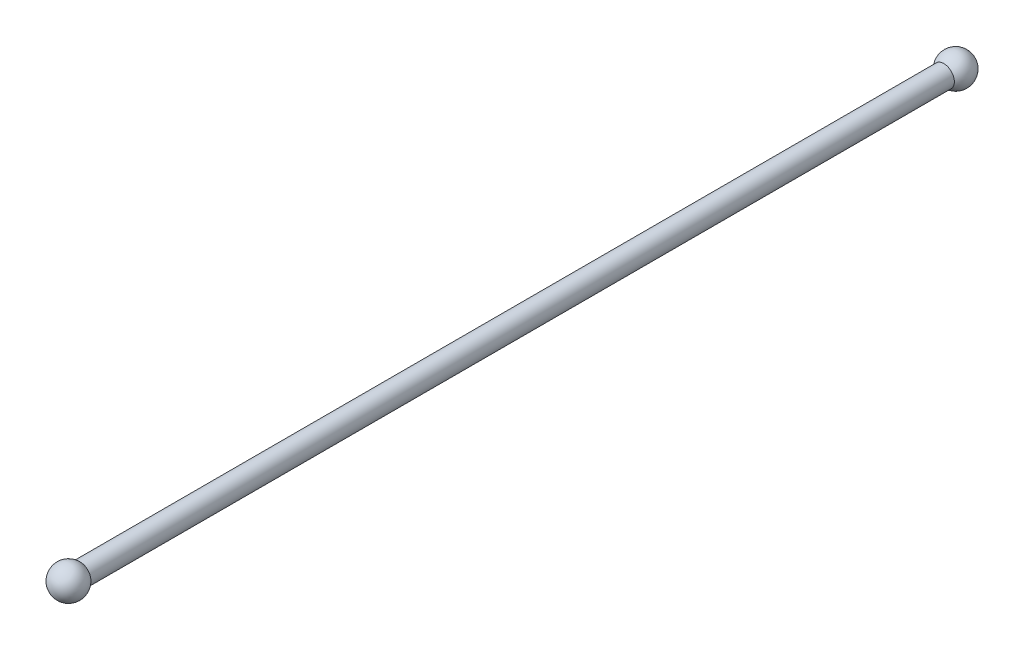
ISO-10303-21;
HEADER;
FILE_DESCRIPTION(('STEP AP214'),'2;1');
FILE_NAME('part.step','',(''),(''),'','','');
FILE_SCHEMA(('AUTOMOTIVE_DESIGN { 1 0 10303 214 1 1 1 1 }'));
ENDSEC;
DATA;
#1=APPLICATION_CONTEXT('core data for automotive mechanical design processes');
#2=APPLICATION_PROTOCOL_DEFINITION('international standard','automotive_design',2000,#1);
#3=PRODUCT_CONTEXT('',#1,'mechanical');
#4=PRODUCT('Part','Part','',(#3));
#5=PRODUCT_RELATED_PRODUCT_CATEGORY('part','',(#4));
#6=PRODUCT_DEFINITION_FORMATION('','',#4);
#7=PRODUCT_DEFINITION_CONTEXT('part definition',#1,'design');
#8=PRODUCT_DEFINITION('design','',#6,#7);
#9=PRODUCT_DEFINITION_SHAPE('','',#8);
#10=(LENGTH_UNIT() NAMED_UNIT(*) SI_UNIT(.MILLI.,.METRE.));
#11=(NAMED_UNIT(*) PLANE_ANGLE_UNIT() SI_UNIT($,.RADIAN.));
#12=(NAMED_UNIT(*) SI_UNIT($,.STERADIAN.) SOLID_ANGLE_UNIT());
#13=UNCERTAINTY_MEASURE_WITH_UNIT(LENGTH_MEASURE(1.E-05),#10,'distance_accuracy_value','');
#14=(GEOMETRIC_REPRESENTATION_CONTEXT(3) GLOBAL_UNCERTAINTY_ASSIGNED_CONTEXT((#13)) GLOBAL_UNIT_ASSIGNED_CONTEXT((#10,
#11,#12)) REPRESENTATION_CONTEXT('',''));
#15=CARTESIAN_POINT('',(0.,0.,0.));
#16=DIRECTION('',(0.,0.,1.));
#17=DIRECTION('',(1.,0.,0.));
#18=AXIS2_PLACEMENT_3D('',#15,#16,#17);
#19=CARTESIAN_POINT('',(0.,0.,-335.));
#20=DIRECTION('',(0.,0.,1.));
#21=DIRECTION('',(-1.,0.,0.));
#22=AXIS2_PLACEMENT_3D('',#19,#20,#21);
#23=SPHERICAL_SURFACE('',#22,6.);
#24=CARTESIAN_POINT('',(0.,0.,-330.527864045));
#25=DIRECTION('',(0.,0.,1.));
#26=DIRECTION('',(1.,0.,0.));
#27=AXIS2_PLACEMENT_3D('',#24,#25,#26);
#28=CIRCLE('',#27,4.);
#29=CARTESIAN_POINT('',(4.,0.,-330.527864045));
#30=VERTEX_POINT('',#29);
#31=EDGE_CURVE('E10',#30,#30,#28,.T.);
#32=ORIENTED_EDGE('',*,*,#31,.F.);
#33=EDGE_LOOP('',(#32));
#34=FACE_BOUND('',#33,.T.);
#35=ADVANCED_FACE('F36',(#34),#23,.T.);
#36=CARTESIAN_POINT('',(0.,0.,0.));
#37=DIRECTION('',(0.,0.,1.));
#38=DIRECTION('',(1.,0.,0.));
#39=AXIS2_PLACEMENT_3D('',#36,#37,#38);
#40=CYLINDRICAL_SURFACE('',#39,3.99999999999998);
#41=CARTESIAN_POINT('',(0.,0.,-4.47213595499962));
#42=DIRECTION('',(0.,0.,1.));
#43=DIRECTION('',(1.,0.,0.));
#44=AXIS2_PLACEMENT_3D('',#41,#42,#43);
#45=CIRCLE('',#44,3.99999999999996);
#46=CARTESIAN_POINT('',(3.99999999999996,0.,-4.47213595499962));
#47=VERTEX_POINT('',#46);
#48=EDGE_CURVE('E43',#47,#47,#45,.T.);
#49=ORIENTED_EDGE('',*,*,#48,.F.);
#50=EDGE_LOOP('',(#49));
#51=FACE_BOUND('',#50,.T.);
#52=ORIENTED_EDGE('',*,*,#31,.T.);
#53=EDGE_LOOP('',(#52));
#54=FACE_BOUND('',#53,.T.);
#55=ADVANCED_FACE('F52',(#51,#54),#40,.T.);
#56=CARTESIAN_POINT('',(0.,0.,0.));
#57=DIRECTION('',(0.,0.,1.));
#58=DIRECTION('',(-1.,0.,0.));
#59=AXIS2_PLACEMENT_3D('',#56,#57,#58);
#60=SPHERICAL_SURFACE('',#59,6.);
#61=ORIENTED_EDGE('',*,*,#48,.T.);
#62=EDGE_LOOP('',(#61));
#63=FACE_BOUND('',#62,.T.);
#64=ADVANCED_FACE('F50',(#63),#60,.T.);
#65=CLOSED_SHELL('',(#35,#55,#64));
#66=MANIFOLD_SOLID_BREP('B2',#65);
#67=ADVANCED_BREP_SHAPE_REPRESENTATION('',(#18,#66),#14);
#68=SHAPE_DEFINITION_REPRESENTATION(#9,#67);
ENDSEC;
END-ISO-10303-21;
